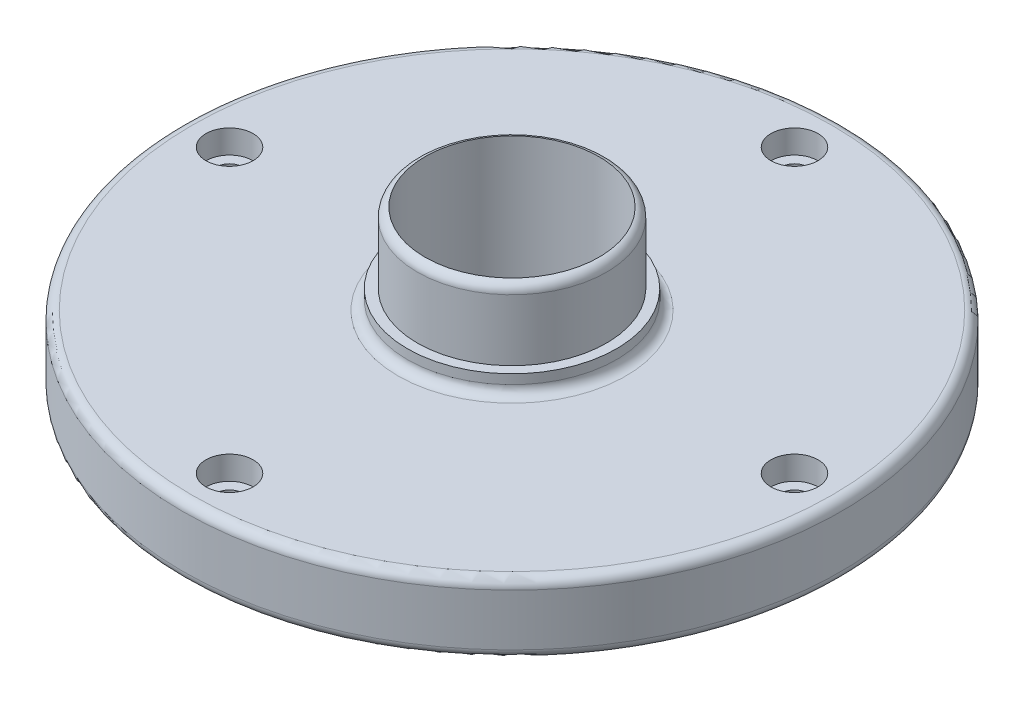
ISO-10303-21;
HEADER;
FILE_DESCRIPTION(('STEP AP214'),'2;1');
FILE_NAME('part.step','',(''),(''),'','','');
FILE_SCHEMA(('AUTOMOTIVE_DESIGN { 1 0 10303 214 1 1 1 1 }'));
ENDSEC;
DATA;
#1=APPLICATION_CONTEXT('core data for automotive mechanical design processes');
#2=APPLICATION_PROTOCOL_DEFINITION('international standard','automotive_design',2000,#1);
#3=PRODUCT_CONTEXT('',#1,'mechanical');
#4=PRODUCT('Part','Part','',(#3));
#5=PRODUCT_RELATED_PRODUCT_CATEGORY('part','',(#4));
#6=PRODUCT_DEFINITION_FORMATION('','',#4);
#7=PRODUCT_DEFINITION_CONTEXT('part definition',#1,'design');
#8=PRODUCT_DEFINITION('design','',#6,#7);
#9=PRODUCT_DEFINITION_SHAPE('','',#8);
#10=(LENGTH_UNIT() NAMED_UNIT(*) SI_UNIT(.MILLI.,.METRE.));
#11=(NAMED_UNIT(*) PLANE_ANGLE_UNIT() SI_UNIT($,.RADIAN.));
#12=(NAMED_UNIT(*) SI_UNIT($,.STERADIAN.) SOLID_ANGLE_UNIT());
#13=UNCERTAINTY_MEASURE_WITH_UNIT(LENGTH_MEASURE(1.E-05),#10,'distance_accuracy_value','');
#14=(GEOMETRIC_REPRESENTATION_CONTEXT(3) GLOBAL_UNCERTAINTY_ASSIGNED_CONTEXT((#13)) GLOBAL_UNIT_ASSIGNED_CONTEXT((#10,
#11,#12)) REPRESENTATION_CONTEXT('',''));
#15=CARTESIAN_POINT('',(0.,0.,0.));
#16=DIRECTION('',(0.,0.,1.));
#17=DIRECTION('',(1.,0.,0.));
#18=AXIS2_PLACEMENT_3D('',#15,#16,#17);
#19=CARTESIAN_POINT('',(0.,15.,0.));
#20=DIRECTION('',(0.,1.,0.));
#21=DIRECTION('',(0.,0.,1.));
#22=AXIS2_PLACEMENT_3D('',#19,#20,#21);
#23=PLANE('',#22);
#24=CARTESIAN_POINT('',(0.,15.,0.));
#25=DIRECTION('',(0.,1.,0.));
#26=DIRECTION('',(0.,0.,1.));
#27=AXIS2_PLACEMENT_3D('',#24,#25,#26);
#28=CIRCLE('',#27,24.2);
#29=CARTESIAN_POINT('',(0.,15.,24.2));
#30=VERTEX_POINT('',#29);
#31=EDGE_CURVE('E10',#30,#30,#28,.F.);
#32=ORIENTED_EDGE('',*,*,#31,.T.);
#33=EDGE_LOOP('',(#32));
#34=FACE_BOUND('',#33,.T.);
#35=CARTESIAN_POINT('',(0.,15.,0.));
#36=DIRECTION('',(0.,1.,0.));
#37=DIRECTION('',(0.,0.,1.));
#38=AXIS2_PLACEMENT_3D('',#35,#36,#37);
#39=CIRCLE('',#38,68.);
#40=CARTESIAN_POINT('',(0.,15.,68.));
#41=VERTEX_POINT('',#40);
#42=EDGE_CURVE('E49',#41,#41,#39,.T.);
#43=ORIENTED_EDGE('',*,*,#42,.T.);
#44=EDGE_LOOP('',(#43));
#45=FACE_BOUND('',#44,.T.);
#46=CARTESIAN_POINT('',(0.,15.,60.));
#47=DIRECTION('',(0.,1.,0.));
#48=DIRECTION('',(0.,0.,1.));
#49=AXIS2_PLACEMENT_3D('',#46,#47,#48);
#50=CIRCLE('',#49,5.);
#51=CARTESIAN_POINT('',(0.,15.,65.));
#52=VERTEX_POINT('',#51);
#53=EDGE_CURVE('E89',#52,#52,#50,.T.);
#54=ORIENTED_EDGE('',*,*,#53,.F.);
#55=EDGE_LOOP('',(#54));
#56=FACE_BOUND('',#55,.T.);
#57=CARTESIAN_POINT('',(-60.,15.,0.));
#58=DIRECTION('',(0.,1.,0.));
#59=DIRECTION('',(0.,0.,1.));
#60=AXIS2_PLACEMENT_3D('',#57,#58,#59);
#61=CIRCLE('',#60,5.);
#62=CARTESIAN_POINT('',(-60.,15.,5.));
#63=VERTEX_POINT('',#62);
#64=EDGE_CURVE('E105',#63,#63,#61,.T.);
#65=ORIENTED_EDGE('',*,*,#64,.F.);
#66=EDGE_LOOP('',(#65));
#67=FACE_BOUND('',#66,.T.);
#68=CARTESIAN_POINT('',(60.,15.,0.));
#69=DIRECTION('',(0.,1.,0.));
#70=DIRECTION('',(0.,0.,1.));
#71=AXIS2_PLACEMENT_3D('',#68,#69,#70);
#72=CIRCLE('',#71,5.);
#73=CARTESIAN_POINT('',(60.,15.,4.99999999999998));
#74=VERTEX_POINT('',#73);
#75=EDGE_CURVE('E121',#74,#74,#72,.T.);
#76=ORIENTED_EDGE('',*,*,#75,.F.);
#77=EDGE_LOOP('',(#76));
#78=FACE_BOUND('',#77,.T.);
#79=CARTESIAN_POINT('',(0.,15.,-60.));
#80=DIRECTION('',(0.,1.,0.));
#81=DIRECTION('',(0.,0.,1.));
#82=AXIS2_PLACEMENT_3D('',#79,#80,#81);
#83=CIRCLE('',#82,5.);
#84=CARTESIAN_POINT('',(0.,15.,-55.));
#85=VERTEX_POINT('',#84);
#86=EDGE_CURVE('E137',#85,#85,#83,.T.);
#87=ORIENTED_EDGE('',*,*,#86,.F.);
#88=EDGE_LOOP('',(#87));
#89=FACE_BOUND('',#88,.T.);
#90=ADVANCED_FACE('F41',(#34,#45,#56,#67,#78,#89),#23,.T.);
#91=CARTESIAN_POINT('',(0.,15.,0.));
#92=DIRECTION('',(0.,-1.,0.));
#93=DIRECTION('',(0.,0.,-1.));
#94=AXIS2_PLACEMENT_3D('',#91,#92,#93);
#95=CYLINDRICAL_SURFACE('',#94,70.);
#96=CARTESIAN_POINT('',(0.,2.,0.));
#97=DIRECTION('',(0.,1.,0.));
#98=DIRECTION('',(0.,0.,1.));
#99=AXIS2_PLACEMENT_3D('',#96,#97,#98);
#100=CIRCLE('',#99,70.);
#101=CARTESIAN_POINT('',(0.,2.,70.));
#102=VERTEX_POINT('',#101);
#103=EDGE_CURVE('E69',#102,#102,#100,.T.);
#104=ORIENTED_EDGE('',*,*,#103,.T.);
#105=EDGE_LOOP('',(#104));
#106=FACE_BOUND('',#105,.T.);
#107=CARTESIAN_POINT('',(0.,13.,0.));
#108=DIRECTION('',(0.,1.,0.));
#109=DIRECTION('',(0.,0.,1.));
#110=AXIS2_PLACEMENT_3D('',#107,#108,#109);
#111=CIRCLE('',#110,70.);
#112=CARTESIAN_POINT('',(0.,13.,70.));
#113=VERTEX_POINT('',#112);
#114=EDGE_CURVE('E73',#113,#113,#111,.F.);
#115=ORIENTED_EDGE('',*,*,#114,.T.);
#116=EDGE_LOOP('',(#115));
#117=FACE_BOUND('',#116,.T.);
#118=ADVANCED_FACE('F176',(#106,#117),#95,.T.);
#119=CARTESIAN_POINT('',(0.,0.,0.));
#120=DIRECTION('',(0.,1.,0.));
#121=DIRECTION('',(0.,0.,1.));
#122=AXIS2_PLACEMENT_3D('',#119,#120,#121);
#123=PLANE('',#122);
#124=CARTESIAN_POINT('',(0.,0.,0.));
#125=DIRECTION('',(0.,1.,0.));
#126=DIRECTION('',(0.,0.,1.));
#127=AXIS2_PLACEMENT_3D('',#124,#125,#126);
#128=CIRCLE('',#127,68.);
#129=CARTESIAN_POINT('',(0.,0.,68.));
#130=VERTEX_POINT('',#129);
#131=EDGE_CURVE('E65',#130,#130,#128,.F.);
#132=ORIENTED_EDGE('',*,*,#131,.T.);
#133=EDGE_LOOP('',(#132));
#134=FACE_BOUND('',#133,.T.);
#135=CARTESIAN_POINT('',(0.,0.,0.));
#136=DIRECTION('',(0.,1.,0.));
#137=DIRECTION('',(0.,0.,1.));
#138=AXIS2_PLACEMENT_3D('',#135,#136,#137);
#139=CIRCLE('',#138,18.5);
#140=CARTESIAN_POINT('',(0.,0.,18.5));
#141=VERTEX_POINT('',#140);
#142=EDGE_CURVE('E145',#141,#141,#139,.T.);
#143=ORIENTED_EDGE('',*,*,#142,.T.);
#144=EDGE_LOOP('',(#143));
#145=FACE_BOUND('',#144,.T.);
#146=CARTESIAN_POINT('',(0.,0.,-60.));
#147=DIRECTION('',(0.,1.,0.));
#148=DIRECTION('',(0.,0.,1.));
#149=AXIS2_PLACEMENT_3D('',#146,#147,#148);
#150=CIRCLE('',#149,2.75);
#151=CARTESIAN_POINT('',(0.,0.,-57.25));
#152=VERTEX_POINT('',#151);
#153=EDGE_CURVE('E125',#152,#152,#150,.T.);
#154=ORIENTED_EDGE('',*,*,#153,.T.);
#155=EDGE_LOOP('',(#154));
#156=FACE_BOUND('',#155,.T.);
#157=CARTESIAN_POINT('',(60.,0.,0.));
#158=DIRECTION('',(0.,1.,0.));
#159=DIRECTION('',(0.,0.,1.));
#160=AXIS2_PLACEMENT_3D('',#157,#158,#159);
#161=CIRCLE('',#160,2.75);
#162=CARTESIAN_POINT('',(60.,0.,2.74999999999998));
#163=VERTEX_POINT('',#162);
#164=EDGE_CURVE('E109',#163,#163,#161,.T.);
#165=ORIENTED_EDGE('',*,*,#164,.T.);
#166=EDGE_LOOP('',(#165));
#167=FACE_BOUND('',#166,.T.);
#168=CARTESIAN_POINT('',(-60.,0.,0.));
#169=DIRECTION('',(0.,1.,0.));
#170=DIRECTION('',(0.,0.,1.));
#171=AXIS2_PLACEMENT_3D('',#168,#169,#170);
#172=CIRCLE('',#171,2.75);
#173=CARTESIAN_POINT('',(-60.,0.,2.75));
#174=VERTEX_POINT('',#173);
#175=EDGE_CURVE('E93',#174,#174,#172,.T.);
#176=ORIENTED_EDGE('',*,*,#175,.T.);
#177=EDGE_LOOP('',(#176));
#178=FACE_BOUND('',#177,.T.);
#179=CARTESIAN_POINT('',(0.,0.,60.));
#180=DIRECTION('',(0.,1.,0.));
#181=DIRECTION('',(0.,0.,1.));
#182=AXIS2_PLACEMENT_3D('',#179,#180,#181);
#183=CIRCLE('',#182,2.75);
#184=CARTESIAN_POINT('',(0.,0.,62.75));
#185=VERTEX_POINT('',#184);
#186=EDGE_CURVE('E77',#185,#185,#183,.T.);
#187=ORIENTED_EDGE('',*,*,#186,.T.);
#188=EDGE_LOOP('',(#187));
#189=FACE_BOUND('',#188,.T.);
#190=ADVANCED_FACE('F181',(#134,#145,#156,#167,#178,#189),#123,.F.);
#191=CARTESIAN_POINT('',(0.,15.,60.));
#192=DIRECTION('',(0.,1.,0.));
#193=DIRECTION('',(0.,0.,1.));
#194=AXIS2_PLACEMENT_3D('',#191,#192,#193);
#195=CYLINDRICAL_SURFACE('',#194,2.75);
#196=ORIENTED_EDGE('',*,*,#186,.F.);
#197=EDGE_LOOP('',(#196));
#198=FACE_BOUND('',#197,.T.);
#199=CARTESIAN_POINT('',(0.,10.,60.));
#200=DIRECTION('',(0.,1.,0.));
#201=DIRECTION('',(0.,0.,1.));
#202=AXIS2_PLACEMENT_3D('',#199,#200,#201);
#203=CIRCLE('',#202,2.75);
#204=CARTESIAN_POINT('',(0.,10.,62.75));
#205=VERTEX_POINT('',#204);
#206=EDGE_CURVE('E81',#205,#205,#203,.T.);
#207=ORIENTED_EDGE('',*,*,#206,.T.);
#208=EDGE_LOOP('',(#207));
#209=FACE_BOUND('',#208,.T.);
#210=ADVANCED_FACE('F186',(#198,#209),#195,.F.);
#211=CARTESIAN_POINT('',(2.75000000000001,10.,60.));
#212=DIRECTION('',(0.,-1.,0.));
#213=DIRECTION('',(0.,0.,-1.));
#214=AXIS2_PLACEMENT_3D('',#211,#212,#213);
#215=PLANE('',#214);
#216=ORIENTED_EDGE('',*,*,#206,.F.);
#217=EDGE_LOOP('',(#216));
#218=FACE_BOUND('',#217,.T.);
#219=CARTESIAN_POINT('',(0.,10.,60.));
#220=DIRECTION('',(0.,1.,0.));
#221=DIRECTION('',(0.,0.,1.));
#222=AXIS2_PLACEMENT_3D('',#219,#220,#221);
#223=CIRCLE('',#222,5.);
#224=CARTESIAN_POINT('',(0.,10.,65.));
#225=VERTEX_POINT('',#224);
#226=EDGE_CURVE('E85',#225,#225,#223,.T.);
#227=ORIENTED_EDGE('',*,*,#226,.T.);
#228=EDGE_LOOP('',(#227));
#229=FACE_BOUND('',#228,.T.);
#230=ADVANCED_FACE('F392',(#218,#229),#215,.F.);
#231=CARTESIAN_POINT('',(0.,15.,60.));
#232=DIRECTION('',(0.,1.,0.));
#233=DIRECTION('',(0.,0.,1.));
#234=AXIS2_PLACEMENT_3D('',#231,#232,#233);
#235=CYLINDRICAL_SURFACE('',#234,5.);
#236=ORIENTED_EDGE('',*,*,#226,.F.);
#237=EDGE_LOOP('',(#236));
#238=FACE_BOUND('',#237,.T.);
#239=ORIENTED_EDGE('',*,*,#53,.T.);
#240=EDGE_LOOP('',(#239));
#241=FACE_BOUND('',#240,.T.);
#242=ADVANCED_FACE('F381',(#238,#241),#235,.F.);
#243=CARTESIAN_POINT('',(-60.,15.,0.));
#244=DIRECTION('',(0.,1.,0.));
#245=DIRECTION('',(0.,0.,1.));
#246=AXIS2_PLACEMENT_3D('',#243,#244,#245);
#247=CYLINDRICAL_SURFACE('',#246,2.75);
#248=ORIENTED_EDGE('',*,*,#175,.F.);
#249=EDGE_LOOP('',(#248));
#250=FACE_BOUND('',#249,.T.);
#251=CARTESIAN_POINT('',(-60.,10.,0.));
#252=DIRECTION('',(0.,1.,0.));
#253=DIRECTION('',(0.,0.,1.));
#254=AXIS2_PLACEMENT_3D('',#251,#252,#253);
#255=CIRCLE('',#254,2.75);
#256=CARTESIAN_POINT('',(-60.,10.,2.75));
#257=VERTEX_POINT('',#256);
#258=EDGE_CURVE('E97',#257,#257,#255,.T.);
#259=ORIENTED_EDGE('',*,*,#258,.T.);
#260=EDGE_LOOP('',(#259));
#261=FACE_BOUND('',#260,.T.);
#262=ADVANCED_FACE('F370',(#250,#261),#247,.F.);
#263=CARTESIAN_POINT('',(-57.25,10.,0.));
#264=DIRECTION('',(0.,-1.,0.));
#265=DIRECTION('',(0.,0.,-1.));
#266=AXIS2_PLACEMENT_3D('',#263,#264,#265);
#267=PLANE('',#266);
#268=ORIENTED_EDGE('',*,*,#258,.F.);
#269=EDGE_LOOP('',(#268));
#270=FACE_BOUND('',#269,.T.);
#271=CARTESIAN_POINT('',(-60.,10.,0.));
#272=DIRECTION('',(0.,1.,0.));
#273=DIRECTION('',(0.,0.,1.));
#274=AXIS2_PLACEMENT_3D('',#271,#272,#273);
#275=CIRCLE('',#274,5.);
#276=CARTESIAN_POINT('',(-60.,10.,5.));
#277=VERTEX_POINT('',#276);
#278=EDGE_CURVE('E101',#277,#277,#275,.T.);
#279=ORIENTED_EDGE('',*,*,#278,.T.);
#280=EDGE_LOOP('',(#279));
#281=FACE_BOUND('',#280,.T.);
#282=ADVANCED_FACE('F359',(#270,#281),#267,.F.);
#283=CARTESIAN_POINT('',(-60.,15.,0.));
#284=DIRECTION('',(0.,1.,0.));
#285=DIRECTION('',(0.,0.,1.));
#286=AXIS2_PLACEMENT_3D('',#283,#284,#285);
#287=CYLINDRICAL_SURFACE('',#286,5.);
#288=ORIENTED_EDGE('',*,*,#278,.F.);
#289=EDGE_LOOP('',(#288));
#290=FACE_BOUND('',#289,.T.);
#291=ORIENTED_EDGE('',*,*,#64,.T.);
#292=EDGE_LOOP('',(#291));
#293=FACE_BOUND('',#292,.T.);
#294=ADVANCED_FACE('F348',(#290,#293),#287,.F.);
#295=CARTESIAN_POINT('',(60.,15.,0.));
#296=DIRECTION('',(0.,1.,0.));
#297=DIRECTION('',(0.,0.,1.));
#298=AXIS2_PLACEMENT_3D('',#295,#296,#297);
#299=CYLINDRICAL_SURFACE('',#298,2.75);
#300=ORIENTED_EDGE('',*,*,#164,.F.);
#301=EDGE_LOOP('',(#300));
#302=FACE_BOUND('',#301,.T.);
#303=CARTESIAN_POINT('',(60.,10.,0.));
#304=DIRECTION('',(0.,1.,0.));
#305=DIRECTION('',(0.,0.,1.));
#306=AXIS2_PLACEMENT_3D('',#303,#304,#305);
#307=CIRCLE('',#306,2.75);
#308=CARTESIAN_POINT('',(60.,10.,2.74999999999998));
#309=VERTEX_POINT('',#308);
#310=EDGE_CURVE('E113',#309,#309,#307,.T.);
#311=ORIENTED_EDGE('',*,*,#310,.T.);
#312=EDGE_LOOP('',(#311));
#313=FACE_BOUND('',#312,.T.);
#314=ADVANCED_FACE('F337',(#302,#313),#299,.F.);
#315=CARTESIAN_POINT('',(62.75,10.,0.));
#316=DIRECTION('',(0.,-1.,0.));
#317=DIRECTION('',(0.,0.,-1.));
#318=AXIS2_PLACEMENT_3D('',#315,#316,#317);
#319=PLANE('',#318);
#320=ORIENTED_EDGE('',*,*,#310,.F.);
#321=EDGE_LOOP('',(#320));
#322=FACE_BOUND('',#321,.T.);
#323=CARTESIAN_POINT('',(60.,10.,0.));
#324=DIRECTION('',(0.,1.,0.));
#325=DIRECTION('',(0.,0.,1.));
#326=AXIS2_PLACEMENT_3D('',#323,#324,#325);
#327=CIRCLE('',#326,5.);
#328=CARTESIAN_POINT('',(60.,10.,4.99999999999998));
#329=VERTEX_POINT('',#328);
#330=EDGE_CURVE('E117',#329,#329,#327,.T.);
#331=ORIENTED_EDGE('',*,*,#330,.T.);
#332=EDGE_LOOP('',(#331));
#333=FACE_BOUND('',#332,.T.);
#334=ADVANCED_FACE('F326',(#322,#333),#319,.F.);
#335=CARTESIAN_POINT('',(60.,15.,0.));
#336=DIRECTION('',(0.,1.,0.));
#337=DIRECTION('',(0.,0.,1.));
#338=AXIS2_PLACEMENT_3D('',#335,#336,#337);
#339=CYLINDRICAL_SURFACE('',#338,5.);
#340=ORIENTED_EDGE('',*,*,#330,.F.);
#341=EDGE_LOOP('',(#340));
#342=FACE_BOUND('',#341,.T.);
#343=ORIENTED_EDGE('',*,*,#75,.T.);
#344=EDGE_LOOP('',(#343));
#345=FACE_BOUND('',#344,.T.);
#346=ADVANCED_FACE('F315',(#342,#345),#339,.F.);
#347=CARTESIAN_POINT('',(0.,15.,-60.));
#348=DIRECTION('',(0.,1.,0.));
#349=DIRECTION('',(0.,0.,1.));
#350=AXIS2_PLACEMENT_3D('',#347,#348,#349);
#351=CYLINDRICAL_SURFACE('',#350,2.75);
#352=ORIENTED_EDGE('',*,*,#153,.F.);
#353=EDGE_LOOP('',(#352));
#354=FACE_BOUND('',#353,.T.);
#355=CARTESIAN_POINT('',(0.,10.,-60.));
#356=DIRECTION('',(0.,1.,0.));
#357=DIRECTION('',(0.,0.,1.));
#358=AXIS2_PLACEMENT_3D('',#355,#356,#357);
#359=CIRCLE('',#358,2.75);
#360=CARTESIAN_POINT('',(0.,10.,-57.25));
#361=VERTEX_POINT('',#360);
#362=EDGE_CURVE('E129',#361,#361,#359,.T.);
#363=ORIENTED_EDGE('',*,*,#362,.T.);
#364=EDGE_LOOP('',(#363));
#365=FACE_BOUND('',#364,.T.);
#366=ADVANCED_FACE('F304',(#354,#365),#351,.F.);
#367=CARTESIAN_POINT('',(2.74999999999998,10.,-60.));
#368=DIRECTION('',(0.,-1.,0.));
#369=DIRECTION('',(0.,0.,-1.));
#370=AXIS2_PLACEMENT_3D('',#367,#368,#369);
#371=PLANE('',#370);
#372=ORIENTED_EDGE('',*,*,#362,.F.);
#373=EDGE_LOOP('',(#372));
#374=FACE_BOUND('',#373,.T.);
#375=CARTESIAN_POINT('',(0.,10.,-60.));
#376=DIRECTION('',(0.,1.,0.));
#377=DIRECTION('',(0.,0.,1.));
#378=AXIS2_PLACEMENT_3D('',#375,#376,#377);
#379=CIRCLE('',#378,5.);
#380=CARTESIAN_POINT('',(0.,10.,-55.));
#381=VERTEX_POINT('',#380);
#382=EDGE_CURVE('E133',#381,#381,#379,.T.);
#383=ORIENTED_EDGE('',*,*,#382,.T.);
#384=EDGE_LOOP('',(#383));
#385=FACE_BOUND('',#384,.T.);
#386=ADVANCED_FACE('F293',(#374,#385),#371,.F.);
#387=CARTESIAN_POINT('',(0.,15.,-60.));
#388=DIRECTION('',(0.,1.,0.));
#389=DIRECTION('',(0.,0.,1.));
#390=AXIS2_PLACEMENT_3D('',#387,#388,#389);
#391=CYLINDRICAL_SURFACE('',#390,5.);
#392=ORIENTED_EDGE('',*,*,#382,.F.);
#393=EDGE_LOOP('',(#392));
#394=FACE_BOUND('',#393,.T.);
#395=ORIENTED_EDGE('',*,*,#86,.T.);
#396=EDGE_LOOP('',(#395));
#397=FACE_BOUND('',#396,.T.);
#398=ADVANCED_FACE('F250',(#394,#397),#391,.F.);
#399=CARTESIAN_POINT('',(0.,34.,0.));
#400=DIRECTION('',(0.,-1.,0.));
#401=DIRECTION('',(0.,0.,-1.));
#402=AXIS2_PLACEMENT_3D('',#399,#400,#401);
#403=CYLINDRICAL_SURFACE('',#402,20.1);
#404=CARTESIAN_POINT('',(0.,32.0404082057735,0.));
#405=DIRECTION('',(0.,1.,0.));
#406=DIRECTION('',(0.,0.,1.));
#407=AXIS2_PLACEMENT_3D('',#404,#405,#406);
#408=CIRCLE('',#407,20.1);
#409=CARTESIAN_POINT('',(0.,32.0404082057735,20.1));
#410=VERTEX_POINT('',#409);
#411=EDGE_CURVE('E59',#410,#410,#408,.F.);
#412=ORIENTED_EDGE('',*,*,#411,.T.);
#413=EDGE_LOOP('',(#412));
#414=FACE_BOUND('',#413,.T.);
#415=CARTESIAN_POINT('',(0.,19.,0.));
#416=DIRECTION('',(0.,1.,0.));
#417=DIRECTION('',(0.,0.,1.));
#418=AXIS2_PLACEMENT_3D('',#415,#416,#417);
#419=CIRCLE('',#418,20.1);
#420=CARTESIAN_POINT('',(0.,19.,20.1));
#421=VERTEX_POINT('',#420);
#422=EDGE_CURVE('E153',#421,#421,#419,.T.);
#423=ORIENTED_EDGE('',*,*,#422,.T.);
#424=EDGE_LOOP('',(#423));
#425=FACE_BOUND('',#424,.T.);
#426=ADVANCED_FACE('F158',(#414,#425),#403,.T.);
#427=CARTESIAN_POINT('',(0.,34.,0.));
#428=DIRECTION('',(0.,-1.,0.));
#429=DIRECTION('',(0.,0.,-1.));
#430=AXIS2_PLACEMENT_3D('',#427,#428,#429);
#431=CYLINDRICAL_SURFACE('',#430,18.5);
#432=CARTESIAN_POINT('',(0.,34.,0.));
#433=DIRECTION('',(0.,1.,0.));
#434=DIRECTION('',(0.,0.,1.));
#435=AXIS2_PLACEMENT_3D('',#432,#433,#434);
#436=CIRCLE('',#435,18.5);
#437=CARTESIAN_POINT('',(0.,34.,18.5));
#438=VERTEX_POINT('',#437);
#439=EDGE_CURVE('E141',#438,#438,#436,.T.);
#440=ORIENTED_EDGE('',*,*,#439,.T.);
#441=EDGE_LOOP('',(#440));
#442=FACE_BOUND('',#441,.T.);
#443=ORIENTED_EDGE('',*,*,#142,.F.);
#444=EDGE_LOOP('',(#443));
#445=FACE_BOUND('',#444,.T.);
#446=ADVANCED_FACE('F163',(#442,#445),#431,.F.);
#447=CARTESIAN_POINT('',(0.,19.,0.));
#448=DIRECTION('',(0.,1.,0.));
#449=DIRECTION('',(0.,0.,1.));
#450=AXIS2_PLACEMENT_3D('',#447,#448,#449);
#451=PLANE('',#450);
#452=CARTESIAN_POINT('',(0.,19.,0.));
#453=DIRECTION('',(0.,1.,0.));
#454=DIRECTION('',(0.,0.,1.));
#455=AXIS2_PLACEMENT_3D('',#452,#453,#454);
#456=CIRCLE('',#455,22.2);
#457=CARTESIAN_POINT('',(0.,19.,22.2));
#458=VERTEX_POINT('',#457);
#459=EDGE_CURVE('E149',#458,#458,#456,.T.);
#460=ORIENTED_EDGE('',*,*,#459,.T.);
#461=EDGE_LOOP('',(#460));
#462=FACE_BOUND('',#461,.T.);
#463=ORIENTED_EDGE('',*,*,#422,.F.);
#464=EDGE_LOOP('',(#463));
#465=FACE_BOUND('',#464,.T.);
#466=ADVANCED_FACE('F160',(#462,#465),#451,.T.);
#467=CARTESIAN_POINT('',(0.,19.,0.));
#468=DIRECTION('',(0.,-1.,0.));
#469=DIRECTION('',(0.,0.,-1.));
#470=AXIS2_PLACEMENT_3D('',#467,#468,#469);
#471=CYLINDRICAL_SURFACE('',#470,22.2);
#472=CARTESIAN_POINT('',(0.,17.,0.));
#473=DIRECTION('',(0.,1.,0.));
#474=DIRECTION('',(0.,0.,1.));
#475=AXIS2_PLACEMENT_3D('',#472,#473,#474);
#476=CIRCLE('',#475,22.2);
#477=CARTESIAN_POINT('',(0.,17.,22.2));
#478=VERTEX_POINT('',#477);
#479=EDGE_CURVE('E54',#478,#478,#476,.T.);
#480=ORIENTED_EDGE('',*,*,#479,.T.);
#481=EDGE_LOOP('',(#480));
#482=FACE_BOUND('',#481,.T.);
#483=ORIENTED_EDGE('',*,*,#459,.F.);
#484=EDGE_LOOP('',(#483));
#485=FACE_BOUND('',#484,.T.);
#486=ADVANCED_FACE('F162',(#482,#485),#471,.T.);
#487=CARTESIAN_POINT('',(0.,2.,0.));
#488=DIRECTION('',(0.,1.,0.));
#489=DIRECTION('',(0.,0.,1.));
#490=AXIS2_PLACEMENT_3D('',#487,#488,#489);
#491=TOROIDAL_SURFACE('',#490,68.,2.);
#492=ORIENTED_EDGE('',*,*,#131,.F.);
#493=EDGE_LOOP('',(#492));
#494=FACE_BOUND('',#493,.T.);
#495=ORIENTED_EDGE('',*,*,#103,.F.);
#496=EDGE_LOOP('',(#495));
#497=FACE_BOUND('',#496,.T.);
#498=ADVANCED_FACE('F170',(#494,#497),#491,.T.);
#499=CARTESIAN_POINT('',(0.,32.0404082057735,0.));
#500=DIRECTION('',(0.,1.,0.));
#501=DIRECTION('',(0.,0.,1.));
#502=AXIS2_PLACEMENT_3D('',#499,#500,#501);
#503=TOROIDAL_SURFACE('',#502,18.1,2.);
#504=ORIENTED_EDGE('',*,*,#411,.F.);
#505=EDGE_LOOP('',(#504));
#506=FACE_BOUND('',#505,.T.);
#507=ORIENTED_EDGE('',*,*,#439,.F.);
#508=EDGE_LOOP('',(#507));
#509=FACE_BOUND('',#508,.T.);
#510=ADVANCED_FACE('F193',(#506,#509),#503,.T.);
#511=CARTESIAN_POINT('',(0.,17.,0.));
#512=DIRECTION('',(0.,1.,0.));
#513=DIRECTION('',(0.,0.,1.));
#514=AXIS2_PLACEMENT_3D('',#511,#512,#513);
#515=TOROIDAL_SURFACE('',#514,24.2,2.);
#516=ORIENTED_EDGE('',*,*,#31,.F.);
#517=EDGE_LOOP('',(#516));
#518=FACE_BOUND('',#517,.T.);
#519=ORIENTED_EDGE('',*,*,#479,.F.);
#520=EDGE_LOOP('',(#519));
#521=FACE_BOUND('',#520,.T.);
#522=ADVANCED_FACE('F196',(#518,#521),#515,.F.);
#523=CARTESIAN_POINT('',(0.,13.,0.));
#524=DIRECTION('',(0.,1.,0.));
#525=DIRECTION('',(0.,0.,1.));
#526=AXIS2_PLACEMENT_3D('',#523,#524,#525);
#527=TOROIDAL_SURFACE('',#526,68.,2.);
#528=ORIENTED_EDGE('',*,*,#114,.F.);
#529=EDGE_LOOP('',(#528));
#530=FACE_BOUND('',#529,.T.);
#531=ORIENTED_EDGE('',*,*,#42,.F.);
#532=EDGE_LOOP('',(#531));
#533=FACE_BOUND('',#532,.T.);
#534=ADVANCED_FACE('F43',(#530,#533),#527,.T.);
#535=CLOSED_SHELL('',(#90,#118,#190,#210,#230,#242,#262,#282,#294,#314,#334,#346,#366,#386,#398,
#426,#446,#466,#486,#498,#510,#522,#534));
#536=MANIFOLD_SOLID_BREP('B2',#535);
#537=ADVANCED_BREP_SHAPE_REPRESENTATION('',(#18,#536),#14);
#538=SHAPE_DEFINITION_REPRESENTATION(#9,#537);
ENDSEC;
END-ISO-10303-21;
